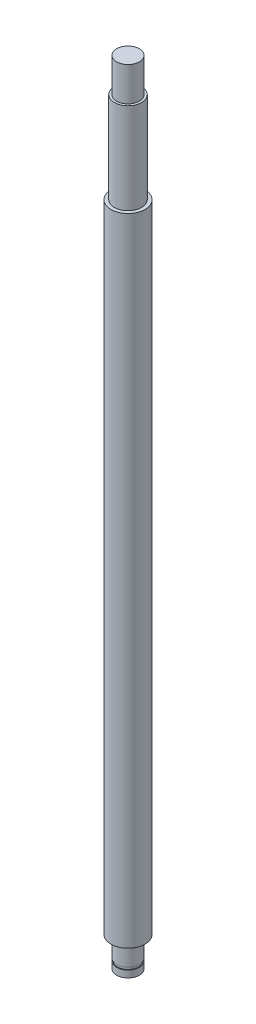
ISO-10303-21;
HEADER;
FILE_DESCRIPTION(('STEP AP214'),'2;1');
FILE_NAME('part.step','',(''),(''),'','','');
FILE_SCHEMA(('AUTOMOTIVE_DESIGN { 1 0 10303 214 1 1 1 1 }'));
ENDSEC;
DATA;
#1=APPLICATION_CONTEXT('core data for automotive mechanical design processes');
#2=APPLICATION_PROTOCOL_DEFINITION('international standard','automotive_design',2000,#1);
#3=PRODUCT_CONTEXT('',#1,'mechanical');
#4=PRODUCT('Part','Part','',(#3));
#5=PRODUCT_RELATED_PRODUCT_CATEGORY('part','',(#4));
#6=PRODUCT_DEFINITION_FORMATION('','',#4);
#7=PRODUCT_DEFINITION_CONTEXT('part definition',#1,'design');
#8=PRODUCT_DEFINITION('design','',#6,#7);
#9=PRODUCT_DEFINITION_SHAPE('','',#8);
#10=(LENGTH_UNIT() NAMED_UNIT(*) SI_UNIT(.MILLI.,.METRE.));
#11=(NAMED_UNIT(*) PLANE_ANGLE_UNIT() SI_UNIT($,.RADIAN.));
#12=(NAMED_UNIT(*) SI_UNIT($,.STERADIAN.) SOLID_ANGLE_UNIT());
#13=UNCERTAINTY_MEASURE_WITH_UNIT(LENGTH_MEASURE(1.E-05),#10,'distance_accuracy_value','');
#14=(GEOMETRIC_REPRESENTATION_CONTEXT(3) GLOBAL_UNCERTAINTY_ASSIGNED_CONTEXT((#13)) GLOBAL_UNIT_ASSIGNED_CONTEXT((#10,
#11,#12)) REPRESENTATION_CONTEXT('',''));
#15=CARTESIAN_POINT('',(0.,0.,0.));
#16=DIRECTION('',(0.,0.,1.));
#17=DIRECTION('',(1.,0.,0.));
#18=AXIS2_PLACEMENT_3D('',#15,#16,#17);
#19=CARTESIAN_POINT('',(0.,-9.,0.));
#20=DIRECTION('',(0.,-1.,0.));
#21=DIRECTION('',(0.,0.,-1.));
#22=AXIS2_PLACEMENT_3D('',#19,#20,#21);
#23=PLANE('',#22);
#24=CARTESIAN_POINT('',(0.,-9.,0.));
#25=DIRECTION('',(0.,-1.,0.));
#26=DIRECTION('',(0.,0.,-1.));
#27=AXIS2_PLACEMENT_3D('',#24,#25,#26);
#28=CIRCLE('',#27,5.);
#29=CARTESIAN_POINT('',(0.,-9.,-5.));
#30=VERTEX_POINT('',#29);
#31=EDGE_CURVE('E62',#30,#30,#28,.T.);
#32=ORIENTED_EDGE('',*,*,#31,.T.);
#33=EDGE_LOOP('',(#32));
#34=FACE_BOUND('',#33,.T.);
#35=CARTESIAN_POINT('',(0.,-9.,0.));
#36=DIRECTION('',(0.,-1.,0.));
#37=DIRECTION('',(0.,0.,-1.));
#38=AXIS2_PLACEMENT_3D('',#35,#36,#37);
#39=CIRCLE('',#38,4.65);
#40=CARTESIAN_POINT('',(0.,-9.,-4.65));
#41=VERTEX_POINT('',#40);
#42=EDGE_CURVE('E68',#41,#41,#39,.T.);
#43=ORIENTED_EDGE('',*,*,#42,.F.);
#44=EDGE_LOOP('',(#43));
#45=FACE_BOUND('',#44,.T.);
#46=ADVANCED_FACE('F35',(#34,#45),#23,.T.);
#47=CARTESIAN_POINT('',(0.,0.,0.));
#48=DIRECTION('',(0.,1.,0.));
#49=DIRECTION('',(0.,0.,1.));
#50=AXIS2_PLACEMENT_3D('',#47,#48,#49);
#51=PLANE('',#50);
#52=CARTESIAN_POINT('',(0.,0.,0.));
#53=DIRECTION('',(0.,1.,0.));
#54=DIRECTION('',(0.,0.,1.));
#55=AXIS2_PLACEMENT_3D('',#52,#53,#54);
#56=CIRCLE('',#55,7.5);
#57=CARTESIAN_POINT('',(0.,0.,7.5));
#58=VERTEX_POINT('',#57);
#59=EDGE_CURVE('E46',#58,#58,#56,.T.);
#60=ORIENTED_EDGE('',*,*,#59,.F.);
#61=EDGE_LOOP('',(#60));
#62=FACE_BOUND('',#61,.T.);
#63=CARTESIAN_POINT('',(0.,0.,0.));
#64=DIRECTION('',(0.,1.,0.));
#65=DIRECTION('',(0.,0.,1.));
#66=AXIS2_PLACEMENT_3D('',#63,#64,#65);
#67=CIRCLE('',#66,5.);
#68=CARTESIAN_POINT('',(0.,0.,5.));
#69=VERTEX_POINT('',#68);
#70=EDGE_CURVE('E10',#69,#69,#67,.F.);
#71=ORIENTED_EDGE('',*,*,#70,.F.);
#72=EDGE_LOOP('',(#71));
#73=FACE_BOUND('',#72,.T.);
#74=ADVANCED_FACE('F102',(#62,#73),#51,.F.);
#75=CARTESIAN_POINT('',(0.,320.,0.));
#76=DIRECTION('',(0.,1.,0.));
#77=DIRECTION('',(0.,0.,1.));
#78=AXIS2_PLACEMENT_3D('',#75,#76,#77);
#79=PLANE('',#78);
#80=CARTESIAN_POINT('',(0.,320.,0.));
#81=DIRECTION('',(0.,1.,0.));
#82=DIRECTION('',(0.,0.,1.));
#83=AXIS2_PLACEMENT_3D('',#80,#81,#82);
#84=CIRCLE('',#83,6.);
#85=CARTESIAN_POINT('',(0.,320.,6.));
#86=VERTEX_POINT('',#85);
#87=EDGE_CURVE('E51',#86,#86,#84,.T.);
#88=ORIENTED_EDGE('',*,*,#87,.T.);
#89=EDGE_LOOP('',(#88));
#90=FACE_BOUND('',#89,.T.);
#91=CARTESIAN_POINT('',(0.,320.,0.));
#92=DIRECTION('',(0.,1.,0.));
#93=DIRECTION('',(0.,0.,1.));
#94=AXIS2_PLACEMENT_3D('',#91,#92,#93);
#95=CIRCLE('',#94,5.);
#96=CARTESIAN_POINT('',(0.,320.,5.));
#97=VERTEX_POINT('',#96);
#98=EDGE_CURVE('E59',#97,#97,#95,.T.);
#99=ORIENTED_EDGE('',*,*,#98,.F.);
#100=EDGE_LOOP('',(#99));
#101=FACE_BOUND('',#100,.T.);
#102=ADVANCED_FACE('F108',(#90,#101),#79,.T.);
#103=CARTESIAN_POINT('',(0.,280.,0.));
#104=DIRECTION('',(0.,1.,0.));
#105=DIRECTION('',(0.,0.,1.));
#106=AXIS2_PLACEMENT_3D('',#103,#104,#105);
#107=PLANE('',#106);
#108=CARTESIAN_POINT('',(0.,280.,0.));
#109=DIRECTION('',(0.,1.,0.));
#110=DIRECTION('',(0.,0.,1.));
#111=AXIS2_PLACEMENT_3D('',#108,#109,#110);
#112=CIRCLE('',#111,7.5);
#113=CARTESIAN_POINT('',(0.,280.,7.5));
#114=VERTEX_POINT('',#113);
#115=EDGE_CURVE('E42',#114,#114,#112,.T.);
#116=ORIENTED_EDGE('',*,*,#115,.T.);
#117=EDGE_LOOP('',(#116));
#118=FACE_BOUND('',#117,.T.);
#119=CARTESIAN_POINT('',(0.,280.,0.));
#120=DIRECTION('',(0.,1.,0.));
#121=DIRECTION('',(0.,0.,1.));
#122=AXIS2_PLACEMENT_3D('',#119,#120,#121);
#123=CIRCLE('',#122,6.);
#124=CARTESIAN_POINT('',(0.,280.,6.));
#125=VERTEX_POINT('',#124);
#126=EDGE_CURVE('E53',#125,#125,#123,.T.);
#127=ORIENTED_EDGE('',*,*,#126,.F.);
#128=EDGE_LOOP('',(#127));
#129=FACE_BOUND('',#128,.T.);
#130=ADVANCED_FACE('F125',(#118,#129),#107,.T.);
#131=CARTESIAN_POINT('',(0.,280.,0.));
#132=DIRECTION('',(0.,-1.,0.));
#133=DIRECTION('',(0.,0.,-1.));
#134=AXIS2_PLACEMENT_3D('',#131,#132,#133);
#135=CYLINDRICAL_SURFACE('',#134,7.5);
#136=ORIENTED_EDGE('',*,*,#115,.F.);
#137=EDGE_LOOP('',(#136));
#138=FACE_BOUND('',#137,.T.);
#139=ORIENTED_EDGE('',*,*,#59,.T.);
#140=EDGE_LOOP('',(#139));
#141=FACE_BOUND('',#140,.T.);
#142=ADVANCED_FACE('F37',(#138,#141),#135,.T.);
#143=CARTESIAN_POINT('',(0.,320.,0.));
#144=DIRECTION('',(0.,-1.,0.));
#145=DIRECTION('',(0.,0.,-1.));
#146=AXIS2_PLACEMENT_3D('',#143,#144,#145);
#147=CYLINDRICAL_SURFACE('',#146,6.);
#148=ORIENTED_EDGE('',*,*,#87,.F.);
#149=EDGE_LOOP('',(#148));
#150=FACE_BOUND('',#149,.T.);
#151=ORIENTED_EDGE('',*,*,#126,.T.);
#152=EDGE_LOOP('',(#151));
#153=FACE_BOUND('',#152,.T.);
#154=ADVANCED_FACE('F121',(#150,#153),#147,.T.);
#155=CARTESIAN_POINT('',(0.,335.,0.));
#156=DIRECTION('',(0.,-1.,0.));
#157=DIRECTION('',(0.,0.,-1.));
#158=AXIS2_PLACEMENT_3D('',#155,#156,#157);
#159=CYLINDRICAL_SURFACE('',#158,5.);
#160=CARTESIAN_POINT('',(0.,335.,0.));
#161=DIRECTION('',(0.,1.,0.));
#162=DIRECTION('',(0.,0.,1.));
#163=AXIS2_PLACEMENT_3D('',#160,#161,#162);
#164=CIRCLE('',#163,5.);
#165=CARTESIAN_POINT('',(0.,335.,5.));
#166=VERTEX_POINT('',#165);
#167=EDGE_CURVE('E56',#166,#166,#164,.T.);
#168=ORIENTED_EDGE('',*,*,#167,.F.);
#169=EDGE_LOOP('',(#168));
#170=FACE_BOUND('',#169,.T.);
#171=ORIENTED_EDGE('',*,*,#98,.T.);
#172=EDGE_LOOP('',(#171));
#173=FACE_BOUND('',#172,.T.);
#174=ADVANCED_FACE('F117',(#170,#173),#159,.T.);
#175=CARTESIAN_POINT('',(0.,335.,0.));
#176=DIRECTION('',(0.,1.,0.));
#177=DIRECTION('',(0.,0.,1.));
#178=AXIS2_PLACEMENT_3D('',#175,#176,#177);
#179=PLANE('',#178);
#180=ORIENTED_EDGE('',*,*,#167,.T.);
#181=EDGE_LOOP('',(#180));
#182=FACE_BOUND('',#181,.T.);
#183=ADVANCED_FACE('F113',(#182),#179,.T.);
#184=CARTESIAN_POINT('',(0.,-9.,0.));
#185=DIRECTION('',(0.,1.,0.));
#186=DIRECTION('',(0.,0.,1.));
#187=AXIS2_PLACEMENT_3D('',#184,#185,#186);
#188=CYLINDRICAL_SURFACE('',#187,5.);
#189=ORIENTED_EDGE('',*,*,#31,.F.);
#190=EDGE_LOOP('',(#189));
#191=FACE_BOUND('',#190,.T.);
#192=ORIENTED_EDGE('',*,*,#70,.T.);
#193=EDGE_LOOP('',(#192));
#194=FACE_BOUND('',#193,.T.);
#195=ADVANCED_FACE('F97',(#191,#194),#188,.T.);
#196=CARTESIAN_POINT('',(0.,-10.1,0.));
#197=DIRECTION('',(0.,1.,0.));
#198=DIRECTION('',(0.,0.,1.));
#199=AXIS2_PLACEMENT_3D('',#196,#197,#198);
#200=CYLINDRICAL_SURFACE('',#199,4.65);
#201=CARTESIAN_POINT('',(0.,-10.1,0.));
#202=DIRECTION('',(0.,-1.,0.));
#203=DIRECTION('',(0.,0.,-1.));
#204=AXIS2_PLACEMENT_3D('',#201,#202,#203);
#205=CIRCLE('',#204,4.65);
#206=CARTESIAN_POINT('',(0.,-10.1,-4.65));
#207=VERTEX_POINT('',#206);
#208=EDGE_CURVE('E67',#207,#207,#205,.T.);
#209=ORIENTED_EDGE('',*,*,#208,.F.);
#210=EDGE_LOOP('',(#209));
#211=FACE_BOUND('',#210,.T.);
#212=ORIENTED_EDGE('',*,*,#42,.T.);
#213=EDGE_LOOP('',(#212));
#214=FACE_BOUND('',#213,.T.);
#215=ADVANCED_FACE('F91',(#211,#214),#200,.T.);
#216=CARTESIAN_POINT('',(0.,-10.1,0.));
#217=DIRECTION('',(0.,-1.,0.));
#218=DIRECTION('',(0.,0.,-1.));
#219=AXIS2_PLACEMENT_3D('',#216,#217,#218);
#220=PLANE('',#219);
#221=CARTESIAN_POINT('',(0.,-10.1,0.));
#222=DIRECTION('',(0.,-1.,0.));
#223=DIRECTION('',(0.,0.,-1.));
#224=AXIS2_PLACEMENT_3D('',#221,#222,#223);
#225=CIRCLE('',#224,5.);
#226=CARTESIAN_POINT('',(0.,-10.1,-5.));
#227=VERTEX_POINT('',#226);
#228=EDGE_CURVE('E74',#227,#227,#225,.T.);
#229=ORIENTED_EDGE('',*,*,#228,.F.);
#230=EDGE_LOOP('',(#229));
#231=FACE_BOUND('',#230,.T.);
#232=ORIENTED_EDGE('',*,*,#208,.T.);
#233=EDGE_LOOP('',(#232));
#234=FACE_BOUND('',#233,.T.);
#235=ADVANCED_FACE('F85',(#231,#234),#220,.F.);
#236=CARTESIAN_POINT('',(0.,-13.1,0.));
#237=DIRECTION('',(0.,1.,0.));
#238=DIRECTION('',(0.,0.,1.));
#239=AXIS2_PLACEMENT_3D('',#236,#237,#238);
#240=CYLINDRICAL_SURFACE('',#239,5.);
#241=CARTESIAN_POINT('',(0.,-13.1,0.));
#242=DIRECTION('',(0.,-1.,0.));
#243=DIRECTION('',(0.,0.,-1.));
#244=AXIS2_PLACEMENT_3D('',#241,#242,#243);
#245=CIRCLE('',#244,5.);
#246=CARTESIAN_POINT('',(0.,-13.1,-5.));
#247=VERTEX_POINT('',#246);
#248=EDGE_CURVE('E71',#247,#247,#245,.T.);
#249=ORIENTED_EDGE('',*,*,#248,.F.);
#250=EDGE_LOOP('',(#249));
#251=FACE_BOUND('',#250,.T.);
#252=ORIENTED_EDGE('',*,*,#228,.T.);
#253=EDGE_LOOP('',(#252));
#254=FACE_BOUND('',#253,.T.);
#255=ADVANCED_FACE('F82',(#251,#254),#240,.T.);
#256=CARTESIAN_POINT('',(0.,-13.1,0.));
#257=DIRECTION('',(0.,-1.,0.));
#258=DIRECTION('',(0.,0.,-1.));
#259=AXIS2_PLACEMENT_3D('',#256,#257,#258);
#260=PLANE('',#259);
#261=ORIENTED_EDGE('',*,*,#248,.T.);
#262=EDGE_LOOP('',(#261));
#263=FACE_BOUND('',#262,.T.);
#264=ADVANCED_FACE('F80',(#263),#260,.T.);
#265=CLOSED_SHELL('',(#46,#74,#102,#130,#142,#154,#174,#183,#195,#215,#235,#255,#264));
#266=MANIFOLD_SOLID_BREP('B2',#265);
#267=ADVANCED_BREP_SHAPE_REPRESENTATION('',(#18,#266),#14);
#268=SHAPE_DEFINITION_REPRESENTATION(#9,#267);
ENDSEC;
END-ISO-10303-21;
